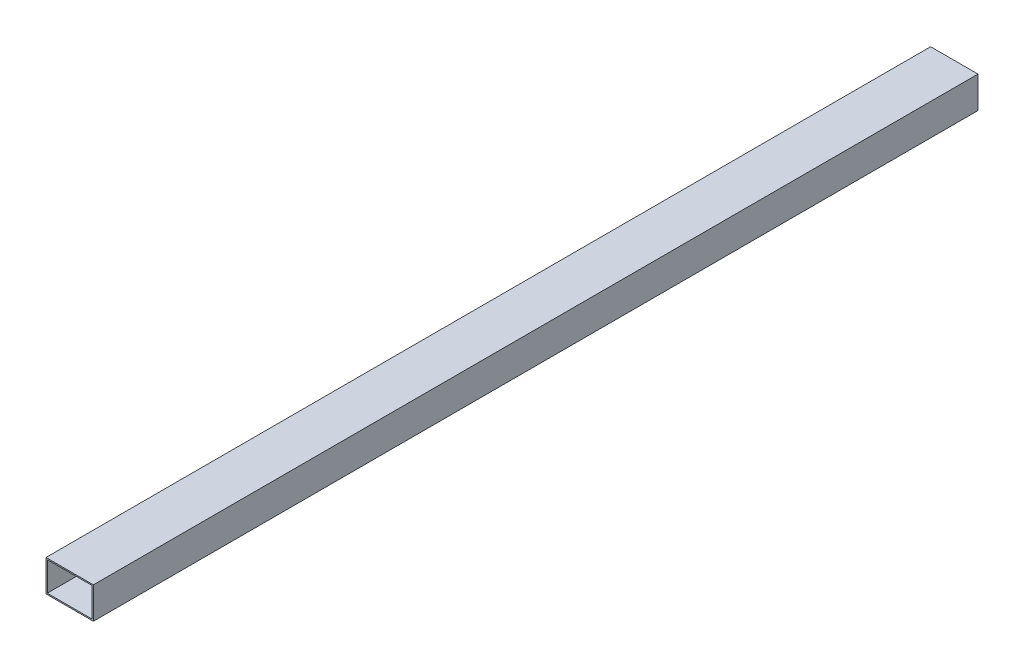
ISO-10303-21;
HEADER;
FILE_DESCRIPTION(('STEP AP214'),'2;1');
FILE_NAME('part.step','',(''),(''),'','','');
FILE_SCHEMA(('AUTOMOTIVE_DESIGN { 1 0 10303 214 1 1 1 1 }'));
ENDSEC;
DATA;
#1=APPLICATION_CONTEXT('core data for automotive mechanical design processes');
#2=APPLICATION_PROTOCOL_DEFINITION('international standard','automotive_design',2000,#1);
#3=PRODUCT_CONTEXT('',#1,'mechanical');
#4=PRODUCT('Part','Part','',(#3));
#5=PRODUCT_RELATED_PRODUCT_CATEGORY('part','',(#4));
#6=PRODUCT_DEFINITION_FORMATION('','',#4);
#7=PRODUCT_DEFINITION_CONTEXT('part definition',#1,'design');
#8=PRODUCT_DEFINITION('design','',#6,#7);
#9=PRODUCT_DEFINITION_SHAPE('','',#8);
#10=(LENGTH_UNIT() NAMED_UNIT(*) SI_UNIT(.MILLI.,.METRE.));
#11=(NAMED_UNIT(*) PLANE_ANGLE_UNIT() SI_UNIT($,.RADIAN.));
#12=(NAMED_UNIT(*) SI_UNIT($,.STERADIAN.) SOLID_ANGLE_UNIT());
#13=UNCERTAINTY_MEASURE_WITH_UNIT(LENGTH_MEASURE(1.E-05),#10,'distance_accuracy_value','');
#14=(GEOMETRIC_REPRESENTATION_CONTEXT(3) GLOBAL_UNCERTAINTY_ASSIGNED_CONTEXT((#13)) GLOBAL_UNIT_ASSIGNED_CONTEXT((#10,
#11,#12)) REPRESENTATION_CONTEXT('',''));
#15=CARTESIAN_POINT('',(0.,0.,0.));
#16=DIRECTION('',(0.,0.,1.));
#17=DIRECTION('',(1.,0.,0.));
#18=AXIS2_PLACEMENT_3D('',#15,#16,#17);
#19=CARTESIAN_POINT('',(-107.863012306017,-68.6292580101181,2800.));
#20=DIRECTION('',(0.,0.,1.));
#21=DIRECTION('',(1.,0.,0.));
#22=AXIS2_PLACEMENT_3D('',#19,#20,#21);
#23=PLANE('',#22);
#24=DIRECTION('',(0.,-1.,0.));
#25=VECTOR('',#24,1.);
#26=CARTESIAN_POINT('',(-107.863012306017,31.370741989882,2800.));
#27=LINE('',#26,#25);
#28=CARTESIAN_POINT('',(-107.863012306017,31.370741989882,2800.));
#29=VERTEX_POINT('',#28);
#30=CARTESIAN_POINT('',(-107.863012306017,-68.6292580101181,2800.));
#31=VERTEX_POINT('',#30);
#32=EDGE_CURVE('E133',#29,#31,#27,.T.);
#33=ORIENTED_EDGE('',*,*,#32,.T.);
#34=DIRECTION('',(1.,0.,0.));
#35=VECTOR('',#34,1.);
#36=CARTESIAN_POINT('',(-107.863012306017,-68.6292580101181,2800.));
#37=LINE('',#36,#35);
#38=CARTESIAN_POINT('',(42.1369876939825,-68.6292580101181,2800.));
#39=VERTEX_POINT('',#38);
#40=EDGE_CURVE('E136',#31,#39,#37,.T.);
#41=ORIENTED_EDGE('',*,*,#40,.T.);
#42=DIRECTION('',(0.,1.,0.));
#43=VECTOR('',#42,1.);
#44=CARTESIAN_POINT('',(42.1369876939825,31.370741989882,2800.));
#45=LINE('',#44,#43);
#46=CARTESIAN_POINT('',(42.1369876939825,31.370741989882,2800.));
#47=VERTEX_POINT('',#46);
#48=EDGE_CURVE('E139',#39,#47,#45,.T.);
#49=ORIENTED_EDGE('',*,*,#48,.T.);
#50=DIRECTION('',(-1.,0.,0.));
#51=VECTOR('',#50,1.);
#52=CARTESIAN_POINT('',(-107.863012306017,31.370741989882,2800.));
#53=LINE('',#52,#51);
#54=EDGE_CURVE('E141',#47,#29,#53,.T.);
#55=ORIENTED_EDGE('',*,*,#54,.T.);
#56=EDGE_LOOP('',(#33,#41,#49,#55));
#57=FACE_BOUND('',#56,.T.);
#58=DIRECTION('',(1.,0.,0.));
#59=VECTOR('',#58,1.);
#60=CARTESIAN_POINT('',(-103.863012306017,-64.629258010118,2800.));
#61=LINE('',#60,#59);
#62=CARTESIAN_POINT('',(-103.863012306017,-64.629258010118,2800.));
#63=VERTEX_POINT('',#62);
#64=CARTESIAN_POINT('',(38.1369876939825,-64.629258010118,2800.));
#65=VERTEX_POINT('',#64);
#66=EDGE_CURVE('E105',#63,#65,#61,.T.);
#67=ORIENTED_EDGE('',*,*,#66,.F.);
#68=DIRECTION('',(0.,-1.,0.));
#69=VECTOR('',#68,1.);
#70=CARTESIAN_POINT('',(-103.863012306017,27.370741989882,2800.));
#71=LINE('',#70,#69);
#72=CARTESIAN_POINT('',(-103.863012306017,27.370741989882,2800.));
#73=VERTEX_POINT('',#72);
#74=EDGE_CURVE('E97',#73,#63,#71,.T.);
#75=ORIENTED_EDGE('',*,*,#74,.F.);
#76=DIRECTION('',(-1.,0.,0.));
#77=VECTOR('',#76,1.);
#78=CARTESIAN_POINT('',(-103.863012306017,27.370741989882,2800.));
#79=LINE('',#78,#77);
#80=CARTESIAN_POINT('',(38.1369876939825,27.3707419898819,2800.));
#81=VERTEX_POINT('',#80);
#82=EDGE_CURVE('E119',#81,#73,#79,.T.);
#83=ORIENTED_EDGE('',*,*,#82,.F.);
#84=DIRECTION('',(0.,1.,0.));
#85=VECTOR('',#84,1.);
#86=CARTESIAN_POINT('',(38.1369876939825,27.3707419898819,2800.));
#87=LINE('',#86,#85);
#88=EDGE_CURVE('E117',#65,#81,#87,.T.);
#89=ORIENTED_EDGE('',*,*,#88,.F.);
#90=EDGE_LOOP('',(#67,#75,#83,#89));
#91=FACE_BOUND('',#90,.T.);
#92=ADVANCED_FACE('F32',(#57,#91),#23,.T.);
#93=CARTESIAN_POINT('',(-107.863012306017,-68.6292580101181,0.));
#94=DIRECTION('',(0.,0.,1.));
#95=DIRECTION('',(1.,0.,0.));
#96=AXIS2_PLACEMENT_3D('',#93,#94,#95);
#97=PLANE('',#96);
#98=DIRECTION('',(0.,-1.,0.));
#99=VECTOR('',#98,1.);
#100=CARTESIAN_POINT('',(-107.863012306017,31.370741989882,0.));
#101=LINE('',#100,#99);
#102=CARTESIAN_POINT('',(-107.863012306017,31.370741989882,0.));
#103=VERTEX_POINT('',#102);
#104=CARTESIAN_POINT('',(-107.863012306017,-68.6292580101181,0.));
#105=VERTEX_POINT('',#104);
#106=EDGE_CURVE('E113',#103,#105,#101,.T.);
#107=ORIENTED_EDGE('',*,*,#106,.F.);
#108=DIRECTION('',(-1.,0.,0.));
#109=VECTOR('',#108,1.);
#110=CARTESIAN_POINT('',(-107.863012306017,31.370741989882,0.));
#111=LINE('',#110,#109);
#112=CARTESIAN_POINT('',(42.1369876939825,31.370741989882,0.));
#113=VERTEX_POINT('',#112);
#114=EDGE_CURVE('E137',#113,#103,#111,.T.);
#115=ORIENTED_EDGE('',*,*,#114,.F.);
#116=DIRECTION('',(0.,1.,0.));
#117=VECTOR('',#116,1.);
#118=CARTESIAN_POINT('',(42.1369876939825,31.370741989882,0.));
#119=LINE('',#118,#117);
#120=CARTESIAN_POINT('',(42.1369876939825,-68.6292580101181,0.));
#121=VERTEX_POINT('',#120);
#122=EDGE_CURVE('E148',#121,#113,#119,.T.);
#123=ORIENTED_EDGE('',*,*,#122,.F.);
#124=DIRECTION('',(1.,0.,0.));
#125=VECTOR('',#124,1.);
#126=CARTESIAN_POINT('',(-107.863012306017,-68.6292580101181,0.));
#127=LINE('',#126,#125);
#128=EDGE_CURVE('E146',#105,#121,#127,.T.);
#129=ORIENTED_EDGE('',*,*,#128,.F.);
#130=EDGE_LOOP('',(#107,#115,#123,#129));
#131=FACE_BOUND('',#130,.T.);
#132=DIRECTION('',(0.,-1.,0.));
#133=VECTOR('',#132,1.);
#134=CARTESIAN_POINT('',(-103.863012306017,27.370741989882,0.));
#135=LINE('',#134,#133);
#136=CARTESIAN_POINT('',(-103.863012306017,27.370741989882,0.));
#137=VERTEX_POINT('',#136);
#138=CARTESIAN_POINT('',(-103.863012306017,-64.629258010118,0.));
#139=VERTEX_POINT('',#138);
#140=EDGE_CURVE('E55',#137,#139,#135,.T.);
#141=ORIENTED_EDGE('',*,*,#140,.T.);
#142=DIRECTION('',(1.,0.,0.));
#143=VECTOR('',#142,1.);
#144=CARTESIAN_POINT('',(-103.863012306017,-64.629258010118,0.));
#145=LINE('',#144,#143);
#146=CARTESIAN_POINT('',(38.1369876939825,-64.629258010118,0.));
#147=VERTEX_POINT('',#146);
#148=EDGE_CURVE('E112',#139,#147,#145,.T.);
#149=ORIENTED_EDGE('',*,*,#148,.T.);
#150=DIRECTION('',(0.,1.,0.));
#151=VECTOR('',#150,1.);
#152=CARTESIAN_POINT('',(38.1369876939825,27.3707419898819,0.));
#153=LINE('',#152,#151);
#154=CARTESIAN_POINT('',(38.1369876939825,27.3707419898819,0.));
#155=VERTEX_POINT('',#154);
#156=EDGE_CURVE('E125',#147,#155,#153,.T.);
#157=ORIENTED_EDGE('',*,*,#156,.T.);
#158=DIRECTION('',(-1.,0.,0.));
#159=VECTOR('',#158,1.);
#160=CARTESIAN_POINT('',(-103.863012306017,27.370741989882,0.));
#161=LINE('',#160,#159);
#162=EDGE_CURVE('E106',#155,#137,#161,.T.);
#163=ORIENTED_EDGE('',*,*,#162,.T.);
#164=EDGE_LOOP('',(#141,#149,#157,#163));
#165=FACE_BOUND('',#164,.T.);
#166=ADVANCED_FACE('F166',(#131,#165),#97,.F.);
#167=CARTESIAN_POINT('',(-107.863012306017,31.370741989882,2800.));
#168=DIRECTION('',(1.,0.,0.));
#169=DIRECTION('',(0.,1.,0.));
#170=AXIS2_PLACEMENT_3D('',#167,#168,#169);
#171=PLANE('',#170);
#172=ORIENTED_EDGE('',*,*,#106,.T.);
#173=DIRECTION('',(0.,0.,-1.));
#174=VECTOR('',#173,1.);
#175=CARTESIAN_POINT('',(-107.863012306017,-68.6292580101181,2800.));
#176=LINE('',#175,#174);
#177=EDGE_CURVE('E11',#31,#105,#176,.T.);
#178=ORIENTED_EDGE('',*,*,#177,.F.);
#179=ORIENTED_EDGE('',*,*,#32,.F.);
#180=DIRECTION('',(0.,0.,-1.));
#181=VECTOR('',#180,1.);
#182=CARTESIAN_POINT('',(-107.863012306017,31.370741989882,2800.));
#183=LINE('',#182,#181);
#184=EDGE_CURVE('E143',#29,#103,#183,.T.);
#185=ORIENTED_EDGE('',*,*,#184,.T.);
#186=EDGE_LOOP('',(#172,#178,#179,#185));
#187=FACE_BOUND('',#186,.T.);
#188=ADVANCED_FACE('F34',(#187),#171,.F.);
#189=CARTESIAN_POINT('',(-107.863012306017,-68.6292580101181,2800.));
#190=DIRECTION('',(0.,1.,0.));
#191=DIRECTION('',(0.,0.,1.));
#192=AXIS2_PLACEMENT_3D('',#189,#190,#191);
#193=PLANE('',#192);
#194=ORIENTED_EDGE('',*,*,#128,.T.);
#195=DIRECTION('',(0.,0.,-1.));
#196=VECTOR('',#195,1.);
#197=CARTESIAN_POINT('',(42.1369876939825,-68.6292580101181,2800.));
#198=LINE('',#197,#196);
#199=EDGE_CURVE('E40',#39,#121,#198,.T.);
#200=ORIENTED_EDGE('',*,*,#199,.F.);
#201=ORIENTED_EDGE('',*,*,#40,.F.);
#202=ORIENTED_EDGE('',*,*,#177,.T.);
#203=EDGE_LOOP('',(#194,#200,#201,#202));
#204=FACE_BOUND('',#203,.T.);
#205=ADVANCED_FACE('F176',(#204),#193,.F.);
#206=CARTESIAN_POINT('',(42.1369876939825,31.370741989882,2800.));
#207=DIRECTION('',(-1.,0.,0.));
#208=DIRECTION('',(0.,0.,1.));
#209=AXIS2_PLACEMENT_3D('',#206,#207,#208);
#210=PLANE('',#209);
#211=ORIENTED_EDGE('',*,*,#122,.T.);
#212=DIRECTION('',(0.,0.,-1.));
#213=VECTOR('',#212,1.);
#214=CARTESIAN_POINT('',(42.1369876939825,31.370741989882,2800.));
#215=LINE('',#214,#213);
#216=EDGE_CURVE('E153',#47,#113,#215,.T.);
#217=ORIENTED_EDGE('',*,*,#216,.F.);
#218=ORIENTED_EDGE('',*,*,#48,.F.);
#219=ORIENTED_EDGE('',*,*,#199,.T.);
#220=EDGE_LOOP('',(#211,#217,#218,#219));
#221=FACE_BOUND('',#220,.T.);
#222=ADVANCED_FACE('F160',(#221),#210,.F.);
#223=CARTESIAN_POINT('',(-107.863012306017,31.370741989882,2800.));
#224=DIRECTION('',(0.,-1.,0.));
#225=DIRECTION('',(1.,0.,0.));
#226=AXIS2_PLACEMENT_3D('',#223,#224,#225);
#227=PLANE('',#226);
#228=ORIENTED_EDGE('',*,*,#114,.T.);
#229=ORIENTED_EDGE('',*,*,#184,.F.);
#230=ORIENTED_EDGE('',*,*,#54,.F.);
#231=ORIENTED_EDGE('',*,*,#216,.T.);
#232=EDGE_LOOP('',(#228,#229,#230,#231));
#233=FACE_BOUND('',#232,.T.);
#234=ADVANCED_FACE('F170',(#233),#227,.F.);
#235=CARTESIAN_POINT('',(-103.863012306017,27.370741989882,2800.));
#236=DIRECTION('',(1.,0.,0.));
#237=DIRECTION('',(0.,1.,0.));
#238=AXIS2_PLACEMENT_3D('',#235,#236,#237);
#239=PLANE('',#238);
#240=ORIENTED_EDGE('',*,*,#140,.F.);
#241=DIRECTION('',(0.,0.,-1.));
#242=VECTOR('',#241,1.);
#243=CARTESIAN_POINT('',(-103.863012306017,27.370741989882,2800.));
#244=LINE('',#243,#242);
#245=EDGE_CURVE('E101',#73,#137,#244,.T.);
#246=ORIENTED_EDGE('',*,*,#245,.F.);
#247=ORIENTED_EDGE('',*,*,#74,.T.);
#248=DIRECTION('',(0.,0.,-1.));
#249=VECTOR('',#248,1.);
#250=CARTESIAN_POINT('',(-103.863012306017,-64.629258010118,2800.));
#251=LINE('',#250,#249);
#252=EDGE_CURVE('E100',#63,#139,#251,.T.);
#253=ORIENTED_EDGE('',*,*,#252,.T.);
#254=EDGE_LOOP('',(#240,#246,#247,#253));
#255=FACE_BOUND('',#254,.T.);
#256=ADVANCED_FACE('F99',(#255),#239,.T.);
#257=CARTESIAN_POINT('',(-103.863012306017,-64.629258010118,2800.));
#258=DIRECTION('',(0.,1.,0.));
#259=DIRECTION('',(0.,0.,1.));
#260=AXIS2_PLACEMENT_3D('',#257,#258,#259);
#261=PLANE('',#260);
#262=ORIENTED_EDGE('',*,*,#148,.F.);
#263=ORIENTED_EDGE('',*,*,#252,.F.);
#264=ORIENTED_EDGE('',*,*,#66,.T.);
#265=DIRECTION('',(0.,0.,-1.));
#266=VECTOR('',#265,1.);
#267=CARTESIAN_POINT('',(38.1369876939825,-64.629258010118,2800.));
#268=LINE('',#267,#266);
#269=EDGE_CURVE('E114',#65,#147,#268,.T.);
#270=ORIENTED_EDGE('',*,*,#269,.T.);
#271=EDGE_LOOP('',(#262,#263,#264,#270));
#272=FACE_BOUND('',#271,.T.);
#273=ADVANCED_FACE('F109',(#272),#261,.T.);
#274=CARTESIAN_POINT('',(38.1369876939825,27.3707419898819,2800.));
#275=DIRECTION('',(-1.,0.,0.));
#276=DIRECTION('',(0.,-1.,0.));
#277=AXIS2_PLACEMENT_3D('',#274,#275,#276);
#278=PLANE('',#277);
#279=ORIENTED_EDGE('',*,*,#156,.F.);
#280=ORIENTED_EDGE('',*,*,#269,.F.);
#281=ORIENTED_EDGE('',*,*,#88,.T.);
#282=DIRECTION('',(0.,0.,-1.));
#283=VECTOR('',#282,1.);
#284=CARTESIAN_POINT('',(38.1369876939825,27.3707419898819,2800.));
#285=LINE('',#284,#283);
#286=EDGE_CURVE('E47',#81,#155,#285,.T.);
#287=ORIENTED_EDGE('',*,*,#286,.T.);
#288=EDGE_LOOP('',(#279,#280,#281,#287));
#289=FACE_BOUND('',#288,.T.);
#290=ADVANCED_FACE('F199',(#289),#278,.T.);
#291=CARTESIAN_POINT('',(-103.863012306017,27.370741989882,2800.));
#292=DIRECTION('',(0.,-1.,0.));
#293=DIRECTION('',(1.,0.,0.));
#294=AXIS2_PLACEMENT_3D('',#291,#292,#293);
#295=PLANE('',#294);
#296=ORIENTED_EDGE('',*,*,#162,.F.);
#297=ORIENTED_EDGE('',*,*,#286,.F.);
#298=ORIENTED_EDGE('',*,*,#82,.T.);
#299=ORIENTED_EDGE('',*,*,#245,.T.);
#300=EDGE_LOOP('',(#296,#297,#298,#299));
#301=FACE_BOUND('',#300,.T.);
#302=ADVANCED_FACE('F203',(#301),#295,.T.);
#303=CLOSED_SHELL('',(#92,#166,#188,#205,#222,#234,#256,#273,#290,#302));
#304=MANIFOLD_SOLID_BREP('B2',#303);
#305=ADVANCED_BREP_SHAPE_REPRESENTATION('',(#18,#304),#14);
#306=SHAPE_DEFINITION_REPRESENTATION(#9,#305);
ENDSEC;
END-ISO-10303-21;
